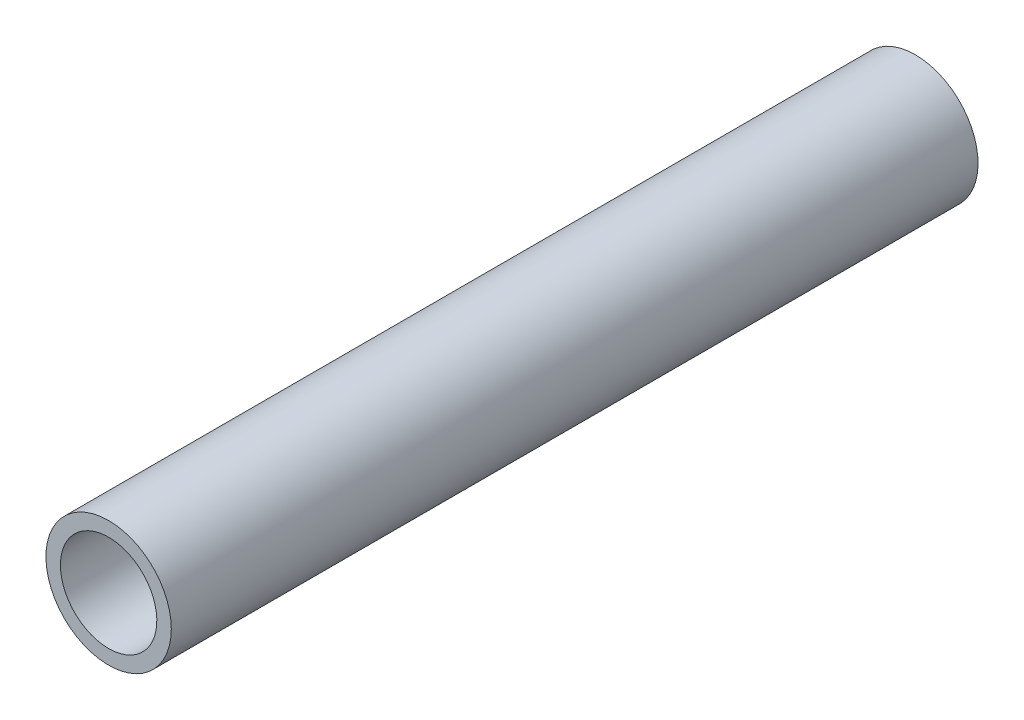
ISO-10303-21;
HEADER;
FILE_DESCRIPTION(('STEP AP214'),'2;1');
FILE_NAME('part.step','',(''),(''),'','','');
FILE_SCHEMA(('AUTOMOTIVE_DESIGN { 1 0 10303 214 1 1 1 1 }'));
ENDSEC;
DATA;
#1=APPLICATION_CONTEXT('core data for automotive mechanical design processes');
#2=APPLICATION_PROTOCOL_DEFINITION('international standard','automotive_design',2000,#1);
#3=PRODUCT_CONTEXT('',#1,'mechanical');
#4=PRODUCT('Part','Part','',(#3));
#5=PRODUCT_RELATED_PRODUCT_CATEGORY('part','',(#4));
#6=PRODUCT_DEFINITION_FORMATION('','',#4);
#7=PRODUCT_DEFINITION_CONTEXT('part definition',#1,'design');
#8=PRODUCT_DEFINITION('design','',#6,#7);
#9=PRODUCT_DEFINITION_SHAPE('','',#8);
#10=(LENGTH_UNIT() NAMED_UNIT(*) SI_UNIT(.MILLI.,.METRE.));
#11=(NAMED_UNIT(*) PLANE_ANGLE_UNIT() SI_UNIT($,.RADIAN.));
#12=(NAMED_UNIT(*) SI_UNIT($,.STERADIAN.) SOLID_ANGLE_UNIT());
#13=UNCERTAINTY_MEASURE_WITH_UNIT(LENGTH_MEASURE(1.E-05),#10,'distance_accuracy_value','');
#14=(GEOMETRIC_REPRESENTATION_CONTEXT(3) GLOBAL_UNCERTAINTY_ASSIGNED_CONTEXT((#13)) GLOBAL_UNIT_ASSIGNED_CONTEXT((#10,
#11,#12)) REPRESENTATION_CONTEXT('',''));
#15=CARTESIAN_POINT('',(0.,0.,0.));
#16=DIRECTION('',(0.,0.,1.));
#17=DIRECTION('',(1.,0.,0.));
#18=AXIS2_PLACEMENT_3D('',#15,#16,#17);
#19=CARTESIAN_POINT('',(95.9755394762586,147.520941453235,30.7308657865102));
#20=DIRECTION('',(0.,0.,-1.));
#21=DIRECTION('',(-1.,0.,0.));
#22=AXIS2_PLACEMENT_3D('',#19,#20,#21);
#23=CYLINDRICAL_SURFACE('',#22,3.9);
#24=CARTESIAN_POINT('',(95.9755394762586,147.520941453235,19.2));
#25=DIRECTION('',(0.,0.,1.));
#26=DIRECTION('',(1.,0.,0.));
#27=AXIS2_PLACEMENT_3D('',#24,#25,#26);
#28=CIRCLE('',#27,3.9);
#29=CARTESIAN_POINT('',(99.8755394762586,147.520941453235,19.2));
#30=VERTEX_POINT('',#29);
#31=EDGE_CURVE('E12',#30,#30,#28,.T.);
#32=ORIENTED_EDGE('',*,*,#31,.F.);
#33=EDGE_LOOP('',(#32));
#34=FACE_BOUND('',#33,.T.);
#35=CARTESIAN_POINT('',(95.9755394762586,147.520941453235,-31.));
#36=DIRECTION('',(0.,0.,-1.));
#37=DIRECTION('',(0.,1.,0.));
#38=AXIS2_PLACEMENT_3D('',#35,#36,#37);
#39=CIRCLE('',#38,3.9);
#40=CARTESIAN_POINT('',(95.9755394762586,151.420941453235,-31.));
#41=VERTEX_POINT('',#40);
#42=EDGE_CURVE('E39',#41,#41,#39,.F.);
#43=ORIENTED_EDGE('',*,*,#42,.T.);
#44=EDGE_LOOP('',(#43));
#45=FACE_BOUND('',#44,.T.);
#46=ADVANCED_FACE('F31',(#34,#45),#23,.T.);
#47=CARTESIAN_POINT('',(95.9755394762586,147.520941453235,19.2));
#48=DIRECTION('',(0.,0.,1.));
#49=DIRECTION('',(0.999813288894355,-0.0193232334316137,0.));
#50=AXIS2_PLACEMENT_3D('',#47,#48,#49);
#51=PLANE('',#50);
#52=CARTESIAN_POINT('',(95.9755394762586,147.520941453235,19.2));
#53=DIRECTION('',(0.,0.,1.));
#54=DIRECTION('',(0.,-1.,0.));
#55=AXIS2_PLACEMENT_3D('',#52,#53,#54);
#56=CIRCLE('',#55,3.);
#57=CARTESIAN_POINT('',(95.9755394762586,144.520941453235,19.2));
#58=VERTEX_POINT('',#57);
#59=EDGE_CURVE('E74',#58,#58,#56,.T.);
#60=ORIENTED_EDGE('',*,*,#59,.F.);
#61=EDGE_LOOP('',(#60));
#62=FACE_BOUND('',#61,.T.);
#63=ORIENTED_EDGE('',*,*,#31,.T.);
#64=EDGE_LOOP('',(#63));
#65=FACE_BOUND('',#64,.T.);
#66=ADVANCED_FACE('F33',(#62,#65),#51,.T.);
#67=CARTESIAN_POINT('',(95.9755394762586,147.520941453235,-31.));
#68=DIRECTION('',(0.,0.,-1.));
#69=DIRECTION('',(-0.633322468500637,0.773888009270243,0.));
#70=AXIS2_PLACEMENT_3D('',#67,#68,#69);
#71=PLANE('',#70);
#72=CARTESIAN_POINT('',(95.9755394762586,147.520941453235,-31.));
#73=DIRECTION('',(0.,0.,-1.));
#74=DIRECTION('',(0.,1.,0.));
#75=AXIS2_PLACEMENT_3D('',#72,#73,#74);
#76=CIRCLE('',#75,3.);
#77=CARTESIAN_POINT('',(95.9755394762586,150.520941453235,-31.));
#78=VERTEX_POINT('',#77);
#79=EDGE_CURVE('E62',#78,#78,#76,.T.);
#80=ORIENTED_EDGE('',*,*,#79,.F.);
#81=EDGE_LOOP('',(#80));
#82=FACE_BOUND('',#81,.T.);
#83=ORIENTED_EDGE('',*,*,#42,.F.);
#84=EDGE_LOOP('',(#83));
#85=FACE_BOUND('',#84,.T.);
#86=ADVANCED_FACE('F80',(#82,#85),#71,.T.);
#87=CARTESIAN_POINT('',(95.9755394762586,147.520941453235,19.2));
#88=DIRECTION('',(0.,0.,1.));
#89=DIRECTION('',(0.,-1.,0.));
#90=AXIS2_PLACEMENT_3D('',#87,#88,#89);
#91=CYLINDRICAL_SURFACE('',#90,3.);
#92=CARTESIAN_POINT('',(95.9755394762586,147.520941453235,7.19999999999999));
#93=DIRECTION('',(0.,0.,1.));
#94=DIRECTION('',(0.,-1.,0.));
#95=AXIS2_PLACEMENT_3D('',#92,#93,#94);
#96=CIRCLE('',#95,3.);
#97=CARTESIAN_POINT('',(95.9755394762586,144.520941453235,7.19999999999999));
#98=VERTEX_POINT('',#97);
#99=EDGE_CURVE('E71',#98,#98,#96,.T.);
#100=ORIENTED_EDGE('',*,*,#99,.F.);
#101=EDGE_LOOP('',(#100));
#102=FACE_BOUND('',#101,.T.);
#103=ORIENTED_EDGE('',*,*,#59,.T.);
#104=EDGE_LOOP('',(#103));
#105=FACE_BOUND('',#104,.T.);
#106=ADVANCED_FACE('F82',(#102,#105),#91,.F.);
#107=CARTESIAN_POINT('',(98.4755394762586,147.520941453235,7.19999999999999));
#108=DIRECTION('',(0.,0.,-1.));
#109=DIRECTION('',(0.,1.,0.));
#110=AXIS2_PLACEMENT_3D('',#107,#108,#109);
#111=PLANE('',#110);
#112=CARTESIAN_POINT('',(95.9755394762586,147.520941453235,7.19999999999999));
#113=DIRECTION('',(0.,0.,1.));
#114=DIRECTION('',(0.,-1.,0.));
#115=AXIS2_PLACEMENT_3D('',#112,#113,#114);
#116=CIRCLE('',#115,2.5);
#117=CARTESIAN_POINT('',(95.9755394762586,145.020941453235,7.19999999999999));
#118=VERTEX_POINT('',#117);
#119=EDGE_CURVE('E68',#118,#118,#116,.T.);
#120=ORIENTED_EDGE('',*,*,#119,.F.);
#121=EDGE_LOOP('',(#120));
#122=FACE_BOUND('',#121,.T.);
#123=ORIENTED_EDGE('',*,*,#99,.T.);
#124=EDGE_LOOP('',(#123));
#125=FACE_BOUND('',#124,.T.);
#126=ADVANCED_FACE('F90',(#122,#125),#111,.F.);
#127=CARTESIAN_POINT('',(95.9755394762586,147.520941453235,19.2));
#128=DIRECTION('',(0.,0.,1.));
#129=DIRECTION('',(0.,-1.,0.));
#130=AXIS2_PLACEMENT_3D('',#127,#128,#129);
#131=CYLINDRICAL_SURFACE('',#130,2.5);
#132=CARTESIAN_POINT('',(95.9755394762586,147.520941453235,4.2));
#133=DIRECTION('',(0.,0.,1.));
#134=DIRECTION('',(0.,-1.,0.));
#135=AXIS2_PLACEMENT_3D('',#132,#133,#134);
#136=CIRCLE('',#135,2.5);
#137=CARTESIAN_POINT('',(95.9755394762586,145.020941453235,4.2));
#138=VERTEX_POINT('',#137);
#139=EDGE_CURVE('E65',#138,#138,#136,.T.);
#140=ORIENTED_EDGE('',*,*,#139,.F.);
#141=EDGE_LOOP('',(#140));
#142=FACE_BOUND('',#141,.T.);
#143=ORIENTED_EDGE('',*,*,#119,.T.);
#144=EDGE_LOOP('',(#143));
#145=FACE_BOUND('',#144,.T.);
#146=ADVANCED_FACE('F116',(#142,#145),#131,.F.);
#147=CARTESIAN_POINT('',(95.9755394762586,147.520941453235,4.2));
#148=DIRECTION('',(0.,0.,1.));
#149=DIRECTION('',(0.,-1.,0.));
#150=AXIS2_PLACEMENT_3D('',#147,#148,#149);
#151=CONICAL_SURFACE('',#150,2.5,1.02974425867666);
#152=CARTESIAN_POINT('',(95.9755394762586,147.520941453235,2.6978484524311));
#153=VERTEX_POINT('',#152);
#154=VERTEX_LOOP('',#153);
#155=FACE_BOUND('',#154,.T.);
#156=ORIENTED_EDGE('',*,*,#139,.T.);
#157=EDGE_LOOP('',(#156));
#158=FACE_BOUND('',#157,.T.);
#159=ADVANCED_FACE('F123',(#155,#158),#151,.F.);
#160=CARTESIAN_POINT('',(95.9755394762586,147.520941453235,-31.));
#161=DIRECTION('',(0.,0.,-1.));
#162=DIRECTION('',(0.,1.,0.));
#163=AXIS2_PLACEMENT_3D('',#160,#161,#162);
#164=CYLINDRICAL_SURFACE('',#163,3.);
#165=CARTESIAN_POINT('',(95.9755394762586,147.520941453235,-19.));
#166=DIRECTION('',(0.,0.,-1.));
#167=DIRECTION('',(0.,1.,0.));
#168=AXIS2_PLACEMENT_3D('',#165,#166,#167);
#169=CIRCLE('',#168,3.);
#170=CARTESIAN_POINT('',(95.9755394762586,150.520941453235,-19.));
#171=VERTEX_POINT('',#170);
#172=EDGE_CURVE('E57',#171,#171,#169,.T.);
#173=ORIENTED_EDGE('',*,*,#172,.F.);
#174=EDGE_LOOP('',(#173));
#175=FACE_BOUND('',#174,.T.);
#176=ORIENTED_EDGE('',*,*,#79,.T.);
#177=EDGE_LOOP('',(#176));
#178=FACE_BOUND('',#177,.T.);
#179=ADVANCED_FACE('F130',(#175,#178),#164,.F.);
#180=CARTESIAN_POINT('',(98.4755394762586,147.520941453235,-19.));
#181=DIRECTION('',(0.,0.,1.));
#182=DIRECTION('',(0.,-1.,0.));
#183=AXIS2_PLACEMENT_3D('',#180,#181,#182);
#184=PLANE('',#183);
#185=CARTESIAN_POINT('',(95.9755394762586,147.520941453235,-19.));
#186=DIRECTION('',(0.,0.,-1.));
#187=DIRECTION('',(0.,1.,0.));
#188=AXIS2_PLACEMENT_3D('',#185,#186,#187);
#189=CIRCLE('',#188,2.5);
#190=CARTESIAN_POINT('',(95.9755394762586,150.020941453235,-19.));
#191=VERTEX_POINT('',#190);
#192=EDGE_CURVE('E54',#191,#191,#189,.T.);
#193=ORIENTED_EDGE('',*,*,#192,.F.);
#194=EDGE_LOOP('',(#193));
#195=FACE_BOUND('',#194,.T.);
#196=ORIENTED_EDGE('',*,*,#172,.T.);
#197=EDGE_LOOP('',(#196));
#198=FACE_BOUND('',#197,.T.);
#199=ADVANCED_FACE('F138',(#195,#198),#184,.F.);
#200=CARTESIAN_POINT('',(95.9755394762586,147.520941453235,-31.));
#201=DIRECTION('',(0.,0.,-1.));
#202=DIRECTION('',(0.,1.,0.));
#203=AXIS2_PLACEMENT_3D('',#200,#201,#202);
#204=CYLINDRICAL_SURFACE('',#203,2.5);
#205=CARTESIAN_POINT('',(95.9755394762586,147.520941453235,-16.));
#206=DIRECTION('',(0.,0.,-1.));
#207=DIRECTION('',(0.,1.,0.));
#208=AXIS2_PLACEMENT_3D('',#205,#206,#207);
#209=CIRCLE('',#208,2.5);
#210=CARTESIAN_POINT('',(95.9755394762586,150.020941453235,-16.));
#211=VERTEX_POINT('',#210);
#212=EDGE_CURVE('E52',#211,#211,#209,.T.);
#213=ORIENTED_EDGE('',*,*,#212,.F.);
#214=EDGE_LOOP('',(#213));
#215=FACE_BOUND('',#214,.T.);
#216=ORIENTED_EDGE('',*,*,#192,.T.);
#217=EDGE_LOOP('',(#216));
#218=FACE_BOUND('',#217,.T.);
#219=ADVANCED_FACE('F48',(#215,#218),#204,.F.);
#220=CARTESIAN_POINT('',(95.9755394762586,147.520941453235,-16.));
#221=DIRECTION('',(0.,0.,-1.));
#222=DIRECTION('',(0.,1.,0.));
#223=AXIS2_PLACEMENT_3D('',#220,#221,#222);
#224=CONICAL_SURFACE('',#223,2.5,1.02974425867666);
#225=CARTESIAN_POINT('',(95.9755394762586,147.520941453235,-14.4978484524311));
#226=VERTEX_POINT('',#225);
#227=VERTEX_LOOP('',#226);
#228=FACE_BOUND('',#227,.T.);
#229=ORIENTED_EDGE('',*,*,#212,.T.);
#230=EDGE_LOOP('',(#229));
#231=FACE_BOUND('',#230,.T.);
#232=ADVANCED_FACE('F45',(#228,#231),#224,.F.);
#233=CLOSED_SHELL('',(#46,#66,#86,#106,#126,#146,#159,#179,#199,#219,#232));
#234=MANIFOLD_SOLID_BREP('B2',#233);
#235=ADVANCED_BREP_SHAPE_REPRESENTATION('',(#18,#234),#14);
#236=SHAPE_DEFINITION_REPRESENTATION(#9,#235);
ENDSEC;
END-ISO-10303-21;
